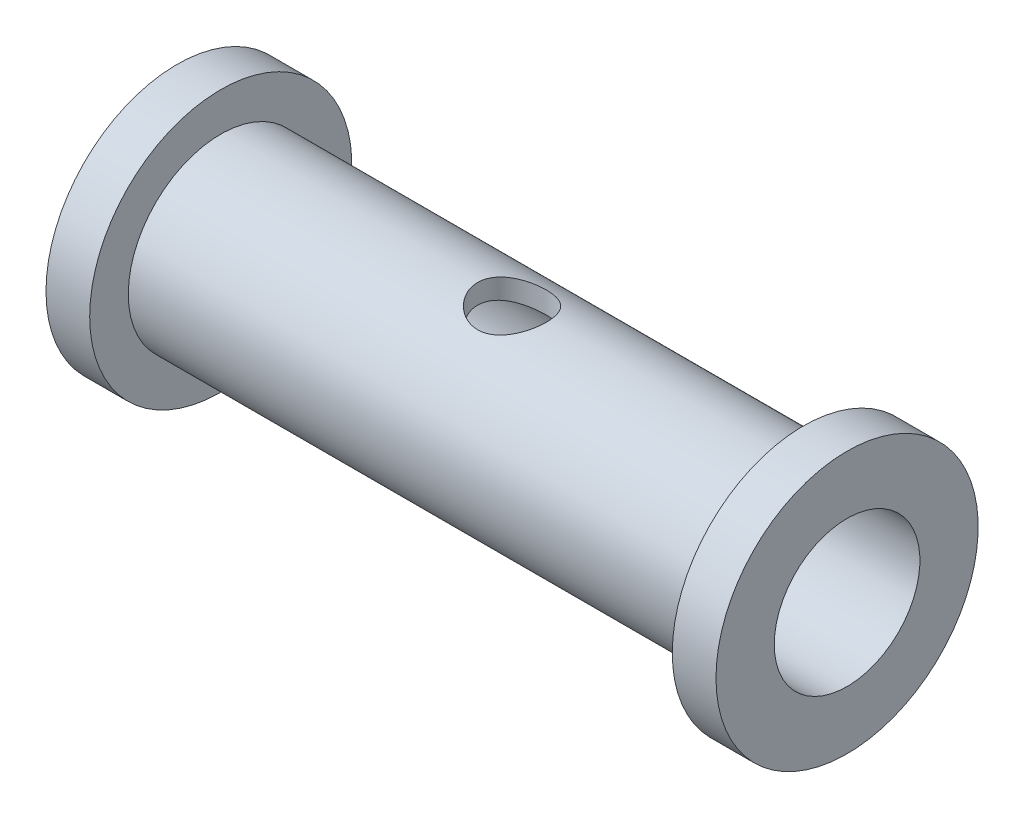
ISO-10303-21;
HEADER;
FILE_DESCRIPTION(('STEP AP214'),'2;1');
FILE_NAME('part.step','',(''),(''),'','','');
FILE_SCHEMA(('AUTOMOTIVE_DESIGN { 1 0 10303 214 1 1 1 1 }'));
ENDSEC;
DATA;
#1=APPLICATION_CONTEXT('core data for automotive mechanical design processes');
#2=APPLICATION_PROTOCOL_DEFINITION('international standard','automotive_design',2000,#1);
#3=PRODUCT_CONTEXT('',#1,'mechanical');
#4=PRODUCT('Part','Part','',(#3));
#5=PRODUCT_RELATED_PRODUCT_CATEGORY('part','',(#4));
#6=PRODUCT_DEFINITION_FORMATION('','',#4);
#7=PRODUCT_DEFINITION_CONTEXT('part definition',#1,'design');
#8=PRODUCT_DEFINITION('design','',#6,#7);
#9=PRODUCT_DEFINITION_SHAPE('','',#8);
#10=(LENGTH_UNIT() NAMED_UNIT(*) SI_UNIT(.MILLI.,.METRE.));
#11=(NAMED_UNIT(*) PLANE_ANGLE_UNIT() SI_UNIT($,.RADIAN.));
#12=(NAMED_UNIT(*) SI_UNIT($,.STERADIAN.) SOLID_ANGLE_UNIT());
#13=UNCERTAINTY_MEASURE_WITH_UNIT(LENGTH_MEASURE(1.E-05),#10,'distance_accuracy_value','');
#14=(GEOMETRIC_REPRESENTATION_CONTEXT(3) GLOBAL_UNCERTAINTY_ASSIGNED_CONTEXT((#13)) GLOBAL_UNIT_ASSIGNED_CONTEXT((#10,
#11,#12)) REPRESENTATION_CONTEXT('',''));
#15=CARTESIAN_POINT('',(0.,0.,0.));
#16=DIRECTION('',(0.,0.,1.));
#17=DIRECTION('',(1.,0.,0.));
#18=AXIS2_PLACEMENT_3D('',#15,#16,#17);
#19=CARTESIAN_POINT('',(-15.2755244755245,0.,0.));
#20=DIRECTION('',(-1.,0.,0.));
#21=DIRECTION('',(0.,0.,1.));
#22=AXIS2_PLACEMENT_3D('',#19,#20,#21);
#23=CYLINDRICAL_SURFACE('',#22,3.175);
#24=CARTESIAN_POINT('',(14.605,0.,0.));
#25=DIRECTION('',(-1.,0.,0.));
#26=DIRECTION('',(0.,0.,1.));
#27=AXIS2_PLACEMENT_3D('',#24,#25,#26);
#28=CIRCLE('',#27,3.175);
#29=CARTESIAN_POINT('',(14.605,0.,3.175));
#30=VERTEX_POINT('',#29);
#31=EDGE_CURVE('E65',#30,#30,#28,.T.);
#32=ORIENTED_EDGE('',*,*,#31,.F.);
#33=EDGE_LOOP('',(#32));
#34=FACE_BOUND('',#33,.T.);
#35=CARTESIAN_POINT('',(-14.605,0.,0.));
#36=DIRECTION('',(-1.,0.,0.));
#37=DIRECTION('',(0.,0.,1.));
#38=AXIS2_PLACEMENT_3D('',#35,#36,#37);
#39=CIRCLE('',#38,3.175);
#40=CARTESIAN_POINT('',(-14.605,0.,3.175));
#41=VERTEX_POINT('',#40);
#42=EDGE_CURVE('E60',#41,#41,#39,.T.);
#43=ORIENTED_EDGE('',*,*,#42,.T.);
#44=EDGE_LOOP('',(#43));
#45=FACE_BOUND('',#44,.T.);
#46=CARTESIAN_POINT('',(0.,2.7983253920872,-1.5));
#47=CARTESIAN_POINT('',(0.0788107476010317,2.79833097649977,-1.49999523547047));
#48=CARTESIAN_POINT('',(0.157735612205732,2.80170427159323,-1.49374832449328));
#49=CARTESIAN_POINT('',(0.313214667514685,2.81472644561665,-1.4690554061353));
#50=CARTESIAN_POINT('',(0.389762907162894,2.82438992585351,-1.45058101361493));
#51=CARTESIAN_POINT('',(0.537952673756733,2.84863009396432,-1.40237253355636));
#52=CARTESIAN_POINT('',(0.609616136431819,2.86318279906116,-1.37269332197988));
#53=CARTESIAN_POINT('',(0.74692939284759,2.89552502377023,-1.30308399064543));
#54=CARTESIAN_POINT('',(0.8125794422789,2.91331440566267,-1.26315430701281));
#55=CARTESIAN_POINT('',(0.941323245258398,2.95172227722859,-1.1707430871524));
#56=CARTESIAN_POINT('',(1.00387788849068,2.97245254188493,-1.11755658650795));
#57=CARTESIAN_POINT('',(1.11959143684936,3.01349951044786,-1.00161259672222));
#58=CARTESIAN_POINT('',(1.17274606260041,3.03381602228766,-0.938850772491945));
#59=CARTESIAN_POINT('',(1.27118937954777,3.07317288716969,-0.801034900704515));
#60=CARTESIAN_POINT('',(1.31583450125175,3.09206866660246,-0.725476017233364));
#61=CARTESIAN_POINT('',(1.39153752206176,3.12503381595021,-0.566861686619154));
#62=CARTESIAN_POINT('',(1.42260309774527,3.13910591174128,-0.483810507023549));
#63=CARTESIAN_POINT('',(1.46819431985617,3.16003750546179,-0.318263833167133));
#64=CARTESIAN_POINT('',(1.4836598006004,3.16730464125021,-0.23607983759682));
#65=CARTESIAN_POINT('',(1.50068669846295,3.17531500926786,-0.0699854874354078));
#66=CARTESIAN_POINT('',(1.50225551712034,3.17606171435844,0.0139239243031286));
#67=CARTESIAN_POINT('',(1.49185310738046,3.1711569999128,0.17410404695592));
#68=CARTESIAN_POINT('',(1.4809263684281,3.16599910390162,0.250460926307549));
#69=CARTESIAN_POINT('',(1.44768451199486,3.15058713309443,0.400106757592313));
#70=CARTESIAN_POINT('',(1.42536854800002,3.14033267949386,0.473395481043944));
#71=CARTESIAN_POINT('',(1.36978180811971,3.11549383971164,0.61616215999247));
#72=CARTESIAN_POINT('',(1.33635400002596,3.10084769916082,0.685567785451937));
#73=CARTESIAN_POINT('',(1.25968096352203,3.06858481389696,0.817962218284119));
#74=CARTESIAN_POINT('',(1.21643213988174,3.05096698193041,0.880948663490016));
#75=CARTESIAN_POINT('',(1.11701776567009,3.01265189942243,1.00453666893054));
#76=CARTESIAN_POINT('',(1.06005736803148,2.9918200943109,1.0644578414785));
#77=CARTESIAN_POINT('',(0.93699705964444,2.95046283361779,1.17424124933889));
#78=CARTESIAN_POINT('',(0.87089145595116,2.92993757775203,1.2240971710571));
#79=CARTESIAN_POINT('',(0.727172138151077,2.89039711066438,1.31484174230845));
#80=CARTESIAN_POINT('',(0.649138941996297,2.87151577260243,1.35512986365461));
#81=CARTESIAN_POINT('',(0.486283743531031,2.83914834140001,1.42170562946273));
#82=CARTESIAN_POINT('',(0.401468219875632,2.82565717160027,1.44800645544408));
#83=CARTESIAN_POINT('',(0.234253704737598,2.80697974613979,1.48387059914899));
#84=CARTESIAN_POINT('',(0.152157558069844,2.80124227464673,1.4945499135996));
#85=CARTESIAN_POINT('',(-0.0128364544628812,2.79714234532468,1.50221328025957));
#86=CARTESIAN_POINT('',(-0.0957338532268694,2.79877582206013,1.49920488189903));
#87=CARTESIAN_POINT('',(-0.25184110118071,2.80865284380239,1.4806017347564));
#88=CARTESIAN_POINT('',(-0.32523813353968,2.81627144126264,1.46619608896935));
#89=CARTESIAN_POINT('',(-0.468463633051388,2.83637948512089,1.42690562153975));
#90=CARTESIAN_POINT('',(-0.538291075738513,2.8488703210638,1.40201781025962));
#91=CARTESIAN_POINT('',(-0.676035807524976,2.87800314814948,1.3412324594274));
#92=CARTESIAN_POINT('',(-0.743715994140066,2.89481019393091,1.30487958898417));
#93=CARTESIAN_POINT('',(-0.872389828600745,2.93050507850425,1.22260967416881));
#94=CARTESIAN_POINT('',(-0.93338011780599,2.94939395301752,1.17668785898318));
#95=CARTESIAN_POINT('',(-1.05395122429284,2.98962533435876,1.07066250220429));
#96=CARTESIAN_POINT('',(-1.11263900919066,3.0110091844446,1.00955462247668));
#97=CARTESIAN_POINT('',(-1.2191662131219,3.05197816465585,0.877952835832725));
#98=CARTESIAN_POINT('',(-1.26700313884629,3.07156288076261,0.807456777596013));
#99=CARTESIAN_POINT('',(-1.35106340432696,3.10717258491727,0.657374049291596));
#100=CARTESIAN_POINT('',(-1.38708244177874,3.12313361565429,0.577656753882327));
#101=CARTESIAN_POINT('',(-1.44486593502356,3.14922093597641,0.412327293299583));
#102=CARTESIAN_POINT('',(-1.46664154231209,3.15935178938716,0.326719797872878));
#103=CARTESIAN_POINT('',(-1.49363889435459,3.17197971044583,0.159896332874223));
#104=CARTESIAN_POINT('',(-1.50011013632642,3.17505233840112,0.078925398284078));
#105=CARTESIAN_POINT('',(-1.49988711965684,3.17494636529876,-0.0829833461657175));
#106=CARTESIAN_POINT('',(-1.49319653511093,3.17176950877122,-0.163921158963004));
#107=CARTESIAN_POINT('',(-1.46770848023088,3.15985410378094,-0.318841842835547));
#108=CARTESIAN_POINT('',(-1.44959197491994,3.15142868675494,-0.392963167600614));
#109=CARTESIAN_POINT('',(-1.40262108547478,3.13010132928976,-0.537026434022491));
#110=CARTESIAN_POINT('',(-1.37376499240882,3.1171986764347,-0.60696770847403));
#111=CARTESIAN_POINT('',(-1.30473490189286,3.08738510301285,-0.744198443618439));
#112=CARTESIAN_POINT('',(-1.26410939390821,3.0703197298679,-0.811226286131094));
#113=CARTESIAN_POINT('',(-1.17328432091972,3.03405477724481,-0.937805412907553));
#114=CARTESIAN_POINT('',(-1.12308040855481,3.01485423033003,-0.997353281796323));
#115=CARTESIAN_POINT('',(-1.00928446778082,2.97425749382228,-1.11287613406119));
#116=CARTESIAN_POINT('',(-0.944896373173603,2.9528185885393,-1.16805442942683));
#117=CARTESIAN_POINT('',(-0.807312145748489,2.91171333700677,-1.26705651381277));
#118=CARTESIAN_POINT('',(-0.734109598744511,2.89204830000693,-1.31087196019013));
#119=CARTESIAN_POINT('',(-0.579232422210802,2.85663554941127,-1.3863737982034));
#120=CARTESIAN_POINT('',(-0.497439352525226,2.84095675906997,-1.41785130272302));
#121=CARTESIAN_POINT('',(-0.328811998329219,2.81635628214136,-1.4661232120466));
#122=CARTESIAN_POINT('',(-0.241995696672077,2.80741192483264,-1.48296690968124));
#123=CARTESIAN_POINT('',(-0.128694633247988,2.80116429672363,-1.49469268672873));
#124=CARTESIAN_POINT('',(-0.10301180774758,2.80010260103933,-1.49668048940514));
#125=CARTESIAN_POINT('',(-0.0515567295081782,2.79868221732461,-1.49933495903092));
#126=CARTESIAN_POINT('',(-0.0257844722890938,2.79832356503778,-1.50000155880871));
#127=CARTESIAN_POINT('',(0.,2.7983253920872,-1.5));
#128=B_SPLINE_CURVE_WITH_KNOTS('',3,(#46,#47,#48,#49,#50,#51,#52,#53,#54,#55,#56,#57,#58,#59,
#60,#61,#62,#63,#64,#65,#66,#67,#68,#69,#70,#71,#72,#73,#74,#75,#76,#77,#78,#79,#80,#81,#82,#83,
#84,#85,#86,#87,#88,#89,#90,#91,#92,#93,#94,#95,#96,#97,#98,#99,#100,#101,#102,#103,#104,#105,
#106,#107,#108,#109,#110,#111,#112,#113,#114,#115,#116,#117,#118,#119,#120,#121,#122,#123,#124,
#125,#126,#127),.UNSPECIFIED.,.T.,.F.,(4,2,2,2,2,2,2,2,2,2,2,2,2,2,2,2,2,2,2,2,2,2,2,2,2,2,2,2,
2,2,2,2,2,2,2,2,2,2,2,2,4),(0.,0.236323871838544,0.473198284289302,0.708927337380699,
0.944646362603916,1.19762429635865,1.45071710395354,1.71864285343498,1.98641694681215,
2.23687152724756,2.48719270436037,2.71802817018661,2.94888079555674,3.1831453100556,
3.41749572162706,3.67216706074964,3.92699765369087,4.19506898546716,4.46288723920479,
4.71043828617548,4.95785281342715,5.18239796950746,5.40700721193729,5.64198832122139,
5.87708686716682,6.13804637958085,6.39906579463174,6.66438519401193,6.92949661955738,
7.17207877892644,7.41459323161728,7.64386670961211,7.87317668624822,8.11282240294707,
8.35257714778319,8.61378861881715,8.87519133270404,9.14084608292566,9.40560248746477,
9.48291651801969,9.56023447921351),.UNSPECIFIED.);
#129=CARTESIAN_POINT('',(0.,2.7983253920872,-1.5));
#130=VERTEX_POINT('',#129);
#131=EDGE_CURVE('E80',#130,#130,#128,.T.);
#132=ORIENTED_EDGE('',*,*,#131,.F.);
#133=EDGE_LOOP('',(#132));
#134=FACE_BOUND('',#133,.T.);
#135=ADVANCED_FACE('F43',(#34,#45,#134),#23,.F.);
#136=CARTESIAN_POINT('',(-15.2755244755245,0.,0.));
#137=DIRECTION('',(-1.,0.,0.));
#138=DIRECTION('',(0.,0.,1.));
#139=AXIS2_PLACEMENT_3D('',#136,#137,#138);
#140=CYLINDRICAL_SURFACE('',#139,4.03225);
#141=CARTESIAN_POINT('',(-12.7,0.,0.));
#142=DIRECTION('',(-1.,0.,0.));
#143=DIRECTION('',(0.,0.,1.));
#144=AXIS2_PLACEMENT_3D('',#141,#142,#143);
#145=CIRCLE('',#144,4.03225);
#146=CARTESIAN_POINT('',(-12.7,0.,4.03225));
#147=VERTEX_POINT('',#146);
#148=EDGE_CURVE('E77',#147,#147,#145,.T.);
#149=ORIENTED_EDGE('',*,*,#148,.F.);
#150=EDGE_LOOP('',(#149));
#151=FACE_BOUND('',#150,.T.);
#152=CARTESIAN_POINT('',(12.7,0.,0.));
#153=DIRECTION('',(-1.,0.,0.));
#154=DIRECTION('',(0.,0.,1.));
#155=AXIS2_PLACEMENT_3D('',#152,#153,#154);
#156=CIRCLE('',#155,4.03225);
#157=CARTESIAN_POINT('',(12.7,0.,4.03225));
#158=VERTEX_POINT('',#157);
#159=EDGE_CURVE('E74',#158,#158,#156,.T.);
#160=ORIENTED_EDGE('',*,*,#159,.T.);
#161=EDGE_LOOP('',(#160));
#162=FACE_BOUND('',#161,.T.);
#163=CARTESIAN_POINT('',(0.,3.74286522099046,-1.5));
#164=CARTESIAN_POINT('',(0.0810605082532311,3.74286262545742,-1.50000280860716));
#165=CARTESIAN_POINT('',(0.162102326967374,3.74552715792148,-1.49340731690282));
#166=CARTESIAN_POINT('',(0.321745734418679,3.75582400206754,-1.46731743450885));
#167=CARTESIAN_POINT('',(0.400347365104893,3.76345622830077,-1.44782326568791));
#168=CARTESIAN_POINT('',(0.552761522089942,3.78270682523499,-1.39674760930536));
#169=CARTESIAN_POINT('',(0.626584881752979,3.79431577447426,-1.36519467055229));
#170=CARTESIAN_POINT('',(0.767918696133514,3.82019671649696,-1.29099805093523));
#171=CARTESIAN_POINT('',(0.83542727939898,3.83446949500481,-1.24835109630931));
#172=CARTESIAN_POINT('',(0.965516163547924,3.86485187022262,-1.15094362675974));
#173=CARTESIAN_POINT('',(1.02774394846759,3.88101491695662,-1.09572887260401));
#174=CARTESIAN_POINT('',(1.14230456469602,3.91291033270932,-0.975717349532377));
#175=CARTESIAN_POINT('',(1.19463532821201,3.92864261114133,-0.910918583249523));
#176=CARTESIAN_POINT('',(1.28960700367383,3.9585379830802,-0.770910034768358));
#177=CARTESIAN_POINT('',(1.33186577238466,3.97263109085241,-0.695424754317507));
#178=CARTESIAN_POINT('',(1.40293902026793,3.99701868248392,-0.537799779474619));
#179=CARTESIAN_POINT('',(1.43175808219767,4.0073144609301,-0.455662364599041));
#180=CARTESIAN_POINT('',(1.47390058439084,4.0225679708103,-0.290770071921704));
#181=CARTESIAN_POINT('',(1.48783069408348,4.02773402720598,-0.208189890177394));
#182=CARTESIAN_POINT('',(1.50174259763788,4.03289304013209,-0.041713164447472));
#183=CARTESIAN_POINT('',(1.50172885505794,4.03288765209057,0.0421829496963453));
#184=CARTESIAN_POINT('',(1.48810912560577,4.02783755319846,0.204565721615127));
#185=CARTESIAN_POINT('',(1.47516507686668,4.0230382565197,0.283116851808199));
#186=CARTESIAN_POINT('',(1.43716422426303,4.00926043121792,0.436840120553872));
#187=CARTESIAN_POINT('',(1.41210656430194,4.00028160721984,0.512012019878063));
#188=CARTESIAN_POINT('',(1.35027656141209,3.97887378010392,0.658133625501671));
#189=CARTESIAN_POINT('',(1.31333993478245,3.96639672742092,0.729006486143544));
#190=CARTESIAN_POINT('',(1.22894508281966,3.93925779087783,0.863722898343242));
#191=CARTESIAN_POINT('',(1.18148349340397,3.92459520895176,0.927564192622355));
#192=CARTESIAN_POINT('',(1.07418544513035,3.89360117668711,1.05030799530885));
#193=CARTESIAN_POINT('',(1.01379320776523,3.87722224784568,1.10871341413277));
#194=CARTESIAN_POINT('',(0.883969759515727,3.84532037315715,1.21475290171194));
#195=CARTESIAN_POINT('',(0.814536358844123,3.82979763598216,1.26238435331695));
#196=CARTESIAN_POINT('',(0.666669776417092,3.80106928483374,1.34645283888991));
#197=CARTESIAN_POINT('',(0.58807496744726,3.78792077737118,1.38262667399653));
#198=CARTESIAN_POINT('',(0.425291566528801,3.7660895474432,1.44103907782427));
#199=CARTESIAN_POINT('',(0.341106055494909,3.75740438800916,1.46328525243885));
#200=CARTESIAN_POINT('',(0.174436686737479,3.74605633474948,1.49208917152611));
#201=CARTESIAN_POINT('',(0.0921097825418008,3.74309126805202,1.49943522240061));
#202=CARTESIAN_POINT('',(-0.0726357872383872,3.74266450431823,1.50050157116152));
#203=CARTESIAN_POINT('',(-0.155054425499946,3.74520146331211,1.49422519657268));
#204=CARTESIAN_POINT('',(-0.313636161157434,3.75518641964114,1.46893918100132));
#205=CARTESIAN_POINT('',(-0.389912048859508,3.76240099881889,1.45053409371867));
#206=CARTESIAN_POINT('',(-0.538259662800263,3.78065295701139,1.40227106523146));
#207=CARTESIAN_POINT('',(-0.610330532611422,3.79169111161244,1.37241080028978));
#208=CARTESIAN_POINT('',(-0.751194437864135,3.81685037763863,1.3008378099256));
#209=CARTESIAN_POINT('',(-0.819766741365623,3.83107065410563,1.25872654174382));
#210=CARTESIAN_POINT('',(-0.94915198555367,3.86082337186448,1.16427295076222));
#211=CARTESIAN_POINT('',(-1.00996211258778,3.87635628559249,1.11192693535525));
#212=CARTESIAN_POINT('',(-1.12601959259903,3.90815180773579,0.994635805675168));
#213=CARTESIAN_POINT('',(-1.18068563392994,3.92439970491397,0.92910952612849));
#214=CARTESIAN_POINT('',(-1.27831314836227,3.95486645770156,0.789414546656814));
#215=CARTESIAN_POINT('',(-1.32127462725588,3.96908531431507,0.715245851008674));
#216=CARTESIAN_POINT('',(-1.39397932428762,3.99387671518709,0.560448512840235));
#217=CARTESIAN_POINT('',(-1.42377184687962,4.00446282651824,0.4798453232322));
#218=CARTESIAN_POINT('',(-1.46921124897475,4.02084161942864,0.314288679595201));
#219=CARTESIAN_POINT('',(-1.48486465693151,4.02663651315213,0.229337252443971));
#220=CARTESIAN_POINT('',(-1.50088594823427,4.03257352309592,0.0627542440502475));
#221=CARTESIAN_POINT('',(-1.50208033338205,4.0330212699538,-0.0187876739602743));
#222=CARTESIAN_POINT('',(-1.49126909256499,4.0290070750733,-0.180860052366927));
#223=CARTESIAN_POINT('',(-1.47926501596501,4.02454570961462,-0.261390630361758));
#224=CARTESIAN_POINT('',(-1.4429761283355,4.01135207395564,-0.417218372620462));
#225=CARTESIAN_POINT('',(-1.41898911418693,4.00272353041785,-0.492594335669173));
#226=CARTESIAN_POINT('',(-1.3597100380317,3.98209514191057,-0.63825977639419));
#227=CARTESIAN_POINT('',(-1.32441583771856,3.97009465932517,-0.70854828889602));
#228=CARTESIAN_POINT('',(-1.24184728584167,3.94330311481887,-0.845254878885198));
#229=CARTESIAN_POINT('',(-1.1941345034695,3.92841650746543,-0.9113890861302));
#230=CARTESIAN_POINT('',(-1.08877832872892,3.89768413406652,-1.03496879561156));
#231=CARTESIAN_POINT('',(-1.03113141506256,3.88183802920943,-1.09241120330676));
#232=CARTESIAN_POINT('',(-0.903995918687687,3.84997088966022,-1.2000328015016));
#233=CARTESIAN_POINT('',(-0.834049003047494,3.83398321642173,-1.24968249159921));
#234=CARTESIAN_POINT('',(-0.686298727869584,3.80457800119995,-1.33653922685383));
#235=CARTESIAN_POINT('',(-0.608494793409266,3.79116064750339,-1.37374536061682));
#236=CARTESIAN_POINT('',(-0.444079552137688,3.76820874872597,-1.43554225419766));
#237=CARTESIAN_POINT('',(-0.357248878006704,3.75883624891752,-1.45961526901652));
#238=CARTESIAN_POINT('',(-0.180269683072115,3.74616784322325,-1.49183756142673));
#239=CARTESIAN_POINT('',(-0.0901232904178125,3.74286810671106,-1.49999687738303));
#240=CARTESIAN_POINT('',(0.,3.74286522099046,-1.5));
#241=B_SPLINE_CURVE_WITH_KNOTS('',3,(#163,#164,#165,#166,#167,#168,#169,#170,#171,#172,#173,
#174,#175,#176,#177,#178,#179,#180,#181,#182,#183,#184,#185,#186,#187,#188,#189,#190,#191,#192,
#193,#194,#195,#196,#197,#198,#199,#200,#201,#202,#203,#204,#205,#206,#207,#208,#209,#210,#211,
#212,#213,#214,#215,#216,#217,#218,#219,#220,#221,#222,#223,#224,#225,#226,#227,#228,#229,#230,
#231,#232,#233,#234,#235,#236,#237,#238,#239,#240),.UNSPECIFIED.,.T.,.F.,(4,2,2,2,2,2,2,2,2,2,2,
2,2,2,2,2,2,2,2,2,2,2,2,2,2,2,2,2,2,2,2,2,2,2,2,2,2,2,4),(0.,0.242846066218496,0.48568795537789,
0.727958449217654,0.97030051654549,1.22341624487427,1.47658479859802,1.73821156443558,
1.99974905375499,2.25016799334158,2.5005067714948,2.73865472806768,2.97681951756097,
3.21843095972489,3.46011973949005,3.71574562239636,3.97143353394805,4.23262841230694,
4.49368052747468,4.74051782572097,4.98729483626132,5.2226173653398,5.45798765597308,
5.70208814363682,5.94627686367409,6.20565491167122,6.46503283131093,6.7234312422891,
6.981710281885,7.22515095079881,7.46856304531068,7.70620625603547,7.94389443411667,
8.1915002919112,8.43919409843272,8.69970220653851,8.96022939066739,9.2303967750537,
9.5003936826016),.UNSPECIFIED.);
#242=CARTESIAN_POINT('',(0.,3.74286522099046,-1.5));
#243=VERTEX_POINT('',#242);
#244=EDGE_CURVE('E47',#243,#243,#241,.T.);
#245=ORIENTED_EDGE('',*,*,#244,.T.);
#246=EDGE_LOOP('',(#245));
#247=FACE_BOUND('',#246,.T.);
#248=ADVANCED_FACE('F94',(#151,#162,#247),#140,.T.);
#249=CARTESIAN_POINT('',(-12.7,0.,0.));
#250=DIRECTION('',(1.,0.,0.));
#251=DIRECTION('',(0.,0.,-1.));
#252=AXIS2_PLACEMENT_3D('',#249,#250,#251);
#253=PLANE('',#252);
#254=ORIENTED_EDGE('',*,*,#148,.T.);
#255=EDGE_LOOP('',(#254));
#256=FACE_BOUND('',#255,.T.);
#257=CARTESIAN_POINT('',(-12.7,0.,0.));
#258=DIRECTION('',(-1.,0.,0.));
#259=DIRECTION('',(0.,0.,1.));
#260=AXIS2_PLACEMENT_3D('',#257,#258,#259);
#261=CIRCLE('',#260,5.715);
#262=CARTESIAN_POINT('',(-12.7,0.,5.715));
#263=VERTEX_POINT('',#262);
#264=EDGE_CURVE('E10',#263,#263,#261,.T.);
#265=ORIENTED_EDGE('',*,*,#264,.F.);
#266=EDGE_LOOP('',(#265));
#267=FACE_BOUND('',#266,.T.);
#268=ADVANCED_FACE('F45',(#256,#267),#253,.T.);
#269=CARTESIAN_POINT('',(-15.2755244755245,0.,0.));
#270=DIRECTION('',(-1.,0.,0.));
#271=DIRECTION('',(0.,0.,1.));
#272=AXIS2_PLACEMENT_3D('',#269,#270,#271);
#273=CYLINDRICAL_SURFACE('',#272,5.715);
#274=ORIENTED_EDGE('',*,*,#264,.T.);
#275=EDGE_LOOP('',(#274));
#276=FACE_BOUND('',#275,.T.);
#277=CARTESIAN_POINT('',(-14.605,0.,0.));
#278=DIRECTION('',(-1.,0.,0.));
#279=DIRECTION('',(0.,0.,1.));
#280=AXIS2_PLACEMENT_3D('',#277,#278,#279);
#281=CIRCLE('',#280,5.715);
#282=CARTESIAN_POINT('',(-14.605,0.,5.715));
#283=VERTEX_POINT('',#282);
#284=EDGE_CURVE('E56',#283,#283,#281,.T.);
#285=ORIENTED_EDGE('',*,*,#284,.F.);
#286=EDGE_LOOP('',(#285));
#287=FACE_BOUND('',#286,.T.);
#288=ADVANCED_FACE('F113',(#276,#287),#273,.T.);
#289=CARTESIAN_POINT('',(-14.605,0.,0.));
#290=DIRECTION('',(1.,0.,0.));
#291=DIRECTION('',(0.,0.,-1.));
#292=AXIS2_PLACEMENT_3D('',#289,#290,#291);
#293=PLANE('',#292);
#294=ORIENTED_EDGE('',*,*,#42,.F.);
#295=EDGE_LOOP('',(#294));
#296=FACE_BOUND('',#295,.T.);
#297=ORIENTED_EDGE('',*,*,#284,.T.);
#298=EDGE_LOOP('',(#297));
#299=FACE_BOUND('',#298,.T.);
#300=ADVANCED_FACE('F108',(#296,#299),#293,.F.);
#301=CARTESIAN_POINT('',(14.605,0.,0.));
#302=DIRECTION('',(1.,0.,0.));
#303=DIRECTION('',(0.,0.,-1.));
#304=AXIS2_PLACEMENT_3D('',#301,#302,#303);
#305=PLANE('',#304);
#306=ORIENTED_EDGE('',*,*,#31,.T.);
#307=EDGE_LOOP('',(#306));
#308=FACE_BOUND('',#307,.T.);
#309=CARTESIAN_POINT('',(14.605,0.,0.));
#310=DIRECTION('',(-1.,0.,0.));
#311=DIRECTION('',(0.,0.,1.));
#312=AXIS2_PLACEMENT_3D('',#309,#310,#311);
#313=CIRCLE('',#312,5.715);
#314=CARTESIAN_POINT('',(14.605,0.,5.715));
#315=VERTEX_POINT('',#314);
#316=EDGE_CURVE('E68',#315,#315,#313,.T.);
#317=ORIENTED_EDGE('',*,*,#316,.F.);
#318=EDGE_LOOP('',(#317));
#319=FACE_BOUND('',#318,.T.);
#320=ADVANCED_FACE('F105',(#308,#319),#305,.T.);
#321=CARTESIAN_POINT('',(-15.2755244755245,0.,0.));
#322=DIRECTION('',(-1.,0.,0.));
#323=DIRECTION('',(0.,0.,1.));
#324=AXIS2_PLACEMENT_3D('',#321,#322,#323);
#325=CYLINDRICAL_SURFACE('',#324,5.715);
#326=CARTESIAN_POINT('',(12.7,0.,0.));
#327=DIRECTION('',(-1.,0.,0.));
#328=DIRECTION('',(0.,0.,1.));
#329=AXIS2_PLACEMENT_3D('',#326,#327,#328);
#330=CIRCLE('',#329,5.715);
#331=CARTESIAN_POINT('',(12.7,0.,5.715));
#332=VERTEX_POINT('',#331);
#333=EDGE_CURVE('E71',#332,#332,#330,.T.);
#334=ORIENTED_EDGE('',*,*,#333,.F.);
#335=EDGE_LOOP('',(#334));
#336=FACE_BOUND('',#335,.T.);
#337=ORIENTED_EDGE('',*,*,#316,.T.);
#338=EDGE_LOOP('',(#337));
#339=FACE_BOUND('',#338,.T.);
#340=ADVANCED_FACE('F102',(#336,#339),#325,.T.);
#341=CARTESIAN_POINT('',(12.7,0.,0.));
#342=DIRECTION('',(1.,0.,0.));
#343=DIRECTION('',(0.,0.,-1.));
#344=AXIS2_PLACEMENT_3D('',#341,#342,#343);
#345=PLANE('',#344);
#346=ORIENTED_EDGE('',*,*,#159,.F.);
#347=EDGE_LOOP('',(#346));
#348=FACE_BOUND('',#347,.T.);
#349=ORIENTED_EDGE('',*,*,#333,.T.);
#350=EDGE_LOOP('',(#349));
#351=FACE_BOUND('',#350,.T.);
#352=ADVANCED_FACE('F92',(#348,#351),#345,.F.);
#353=CARTESIAN_POINT('',(0.,5.715,0.));
#354=DIRECTION('',(0.,-1.,0.));
#355=DIRECTION('',(0.,0.,-1.));
#356=AXIS2_PLACEMENT_3D('',#353,#354,#355);
#357=CYLINDRICAL_SURFACE('',#356,1.5);
#358=ORIENTED_EDGE('',*,*,#244,.F.);
#359=EDGE_LOOP('',(#358));
#360=FACE_BOUND('',#359,.T.);
#361=ORIENTED_EDGE('',*,*,#131,.T.);
#362=EDGE_LOOP('',(#361));
#363=FACE_BOUND('',#362,.T.);
#364=ADVANCED_FACE('F89',(#360,#363),#357,.F.);
#365=CLOSED_SHELL('',(#135,#248,#268,#288,#300,#320,#340,#352,#364));
#366=MANIFOLD_SOLID_BREP('B2',#365);
#367=ADVANCED_BREP_SHAPE_REPRESENTATION('',(#18,#366),#14);
#368=SHAPE_DEFINITION_REPRESENTATION(#9,#367);
ENDSEC;
END-ISO-10303-21;
